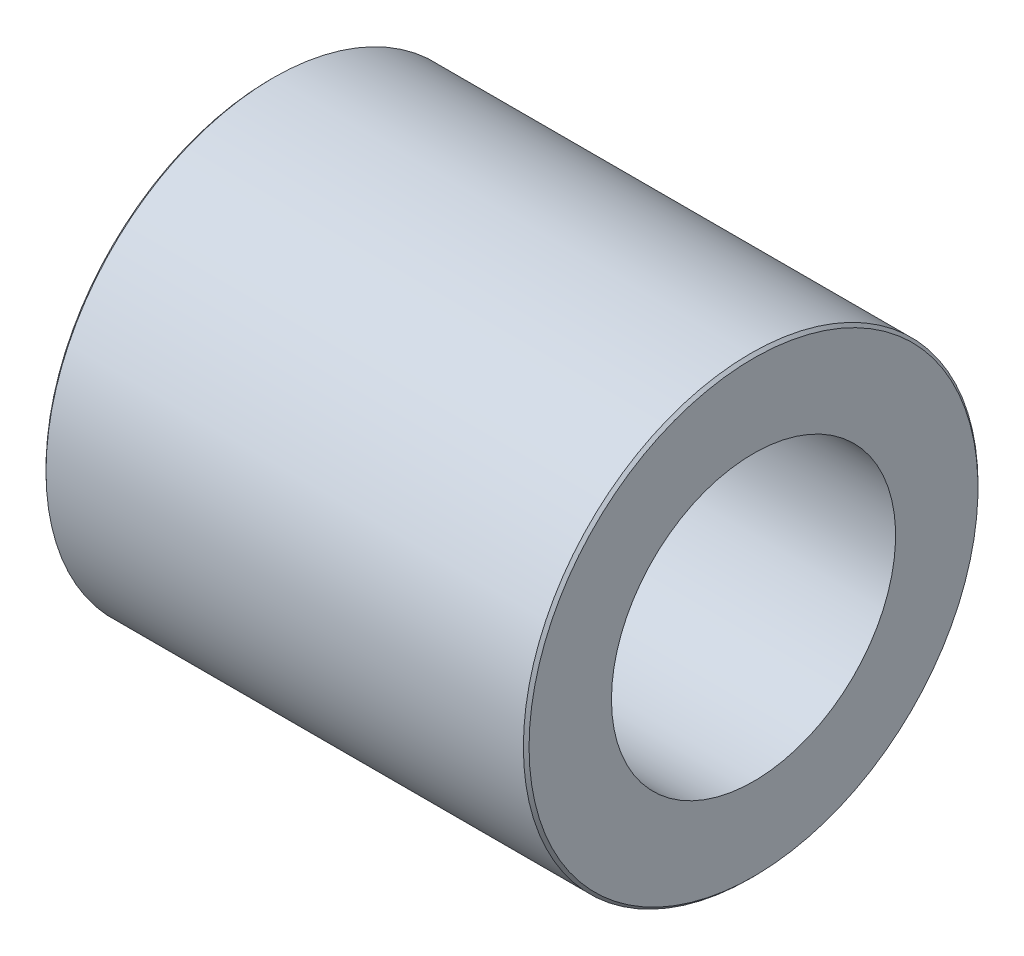
ISO-10303-21;
HEADER;
FILE_DESCRIPTION(('STEP AP214'),'2;1');
FILE_NAME('part.step','',(''),(''),'','','');
FILE_SCHEMA(('AUTOMOTIVE_DESIGN { 1 0 10303 214 1 1 1 1 }'));
ENDSEC;
DATA;
#1=APPLICATION_CONTEXT('core data for automotive mechanical design processes');
#2=APPLICATION_PROTOCOL_DEFINITION('international standard','automotive_design',2000,#1);
#3=PRODUCT_CONTEXT('',#1,'mechanical');
#4=PRODUCT('Part','Part','',(#3));
#5=PRODUCT_RELATED_PRODUCT_CATEGORY('part','',(#4));
#6=PRODUCT_DEFINITION_FORMATION('','',#4);
#7=PRODUCT_DEFINITION_CONTEXT('part definition',#1,'design');
#8=PRODUCT_DEFINITION('design','',#6,#7);
#9=PRODUCT_DEFINITION_SHAPE('','',#8);
#10=(LENGTH_UNIT() NAMED_UNIT(*) SI_UNIT(.MILLI.,.METRE.));
#11=(NAMED_UNIT(*) PLANE_ANGLE_UNIT() SI_UNIT($,.RADIAN.));
#12=(NAMED_UNIT(*) SI_UNIT($,.STERADIAN.) SOLID_ANGLE_UNIT());
#13=UNCERTAINTY_MEASURE_WITH_UNIT(LENGTH_MEASURE(1.E-05),#10,'distance_accuracy_value','');
#14=(GEOMETRIC_REPRESENTATION_CONTEXT(3) GLOBAL_UNCERTAINTY_ASSIGNED_CONTEXT((#13)) GLOBAL_UNIT_ASSIGNED_CONTEXT((#10,
#11,#12)) REPRESENTATION_CONTEXT('',''));
#15=CARTESIAN_POINT('',(0.,0.,0.));
#16=DIRECTION('',(0.,0.,1.));
#17=DIRECTION('',(1.,0.,0.));
#18=AXIS2_PLACEMENT_3D('',#15,#16,#17);
#19=CARTESIAN_POINT('',(2.8,-6.06217782649416,-3.49999999999663));
#20=DIRECTION('',(1.,0.,0.));
#21=DIRECTION('',(0.,0.,-1.));
#22=AXIS2_PLACEMENT_3D('',#19,#20,#21);
#23=PLANE('',#22);
#24=CARTESIAN_POINT('',(2.79999999997926,-5.6291651246,-3.25));
#25=DIRECTION('',(1.,0.,0.));
#26=DIRECTION('',(0.,0.,-1.));
#27=AXIS2_PLACEMENT_3D('',#24,#25,#26);
#28=CIRCLE('',#27,0.999999999950099);
#29=CARTESIAN_POINT('',(2.79999999997926,-5.6291651246,-4.2499999999501));
#30=VERTEX_POINT('',#29);
#31=EDGE_CURVE('E20',#30,#30,#28,.F.);
#32=ORIENTED_EDGE('',*,*,#31,.T.);
#33=EDGE_LOOP('',(#32));
#34=FACE_BOUND('',#33,.T.);
#35=ADVANCED_FACE('F17',(#34),#23,.F.);
#36=CARTESIAN_POINT('',(2.8,0.,7.));
#37=DIRECTION('',(1.,0.,0.));
#38=DIRECTION('',(0.,0.,-1.));
#39=AXIS2_PLACEMENT_3D('',#36,#37,#38);
#40=PLANE('',#39);
#41=CARTESIAN_POINT('',(2.79999999997926,0.,6.5));
#42=DIRECTION('',(1.,0.,0.));
#43=DIRECTION('',(0.,0.,-1.));
#44=AXIS2_PLACEMENT_3D('',#41,#42,#43);
#45=CIRCLE('',#44,1.00000000005002);
#46=CARTESIAN_POINT('',(2.79999999997926,0.,5.49999999994998));
#47=VERTEX_POINT('',#46);
#48=EDGE_CURVE('E180',#47,#47,#45,.F.);
#49=ORIENTED_EDGE('',*,*,#48,.T.);
#50=EDGE_LOOP('',(#49));
#51=FACE_BOUND('',#50,.T.);
#52=ADVANCED_FACE('F202',(#51),#40,.F.);
#53=CARTESIAN_POINT('',(2.8,6.06217782649416,-3.49999999999663));
#54=DIRECTION('',(1.,0.,0.));
#55=DIRECTION('',(0.,0.,-1.));
#56=AXIS2_PLACEMENT_3D('',#53,#54,#55);
#57=PLANE('',#56);
#58=CARTESIAN_POINT('',(2.79999999997926,5.6291651246,-3.25));
#59=DIRECTION('',(1.,0.,0.));
#60=DIRECTION('',(0.,0.,-1.));
#61=AXIS2_PLACEMENT_3D('',#58,#59,#60);
#62=CIRCLE('',#61,0.999999999950099);
#63=CARTESIAN_POINT('',(2.79999999997926,5.6291651246,-4.2499999999501));
#64=VERTEX_POINT('',#63);
#65=EDGE_CURVE('E153',#64,#64,#62,.F.);
#66=ORIENTED_EDGE('',*,*,#65,.T.);
#67=EDGE_LOOP('',(#66));
#68=FACE_BOUND('',#67,.T.);
#69=ADVANCED_FACE('F191',(#68),#57,.F.);
#70=CARTESIAN_POINT('',(2.79999999997926,-5.6291651246,-3.25));
#71=DIRECTION('',(1.,0.,0.));
#72=DIRECTION('',(0.,0.,-1.));
#73=AXIS2_PLACEMENT_3D('',#70,#71,#72);
#74=CONICAL_SURFACE('',#73,0.999999999950099,1.04718484908716);
#75=CARTESIAN_POINT('',(2.59999999997262,-5.6291651246,-3.25));
#76=DIRECTION('',(-1.,0.,0.));
#77=DIRECTION('',(0.,-0.866025403762104,-0.500000000038685));
#78=AXIS2_PLACEMENT_3D('',#75,#76,#77);
#79=CIRCLE('',#78,0.653599999987272);
#80=CARTESIAN_POINT('',(2.59999999997262,-6.19519932848789,-3.57680000001892));
#81=VERTEX_POINT('',#80);
#82=EDGE_CURVE('E150',#81,#81,#79,.T.);
#83=ORIENTED_EDGE('',*,*,#82,.T.);
#84=EDGE_LOOP('',(#83));
#85=FACE_BOUND('',#84,.T.);
#86=ORIENTED_EDGE('',*,*,#31,.F.);
#87=EDGE_LOOP('',(#86));
#88=FACE_BOUND('',#87,.T.);
#89=ADVANCED_FACE('F188',(#85,#88),#74,.F.);
#90=CARTESIAN_POINT('',(2.79999999997926,0.,6.5));
#91=DIRECTION('',(1.,0.,0.));
#92=DIRECTION('',(0.,0.,-1.));
#93=AXIS2_PLACEMENT_3D('',#90,#91,#92);
#94=CONICAL_SURFACE('',#93,1.00000000005002,1.04718484909684);
#95=CARTESIAN_POINT('',(2.60000000002947,0.,6.5));
#96=DIRECTION('',(-1.,0.,0.));
#97=DIRECTION('',(0.,0.,1.));
#98=AXIS2_PLACEMENT_3D('',#95,#96,#97);
#99=CIRCLE('',#98,0.653599999980997);
#100=CARTESIAN_POINT('',(2.60000000002947,0.,7.153599999981));
#101=VERTEX_POINT('',#100);
#102=EDGE_CURVE('E147',#101,#101,#99,.T.);
#103=ORIENTED_EDGE('',*,*,#102,.T.);
#104=EDGE_LOOP('',(#103));
#105=FACE_BOUND('',#104,.T.);
#106=ORIENTED_EDGE('',*,*,#48,.F.);
#107=EDGE_LOOP('',(#106));
#108=FACE_BOUND('',#107,.T.);
#109=ADVANCED_FACE('F190',(#105,#108),#94,.F.);
#110=CARTESIAN_POINT('',(2.79999999997926,5.6291651246,-3.25));
#111=DIRECTION('',(1.,0.,0.));
#112=DIRECTION('',(0.,0.,-1.));
#113=AXIS2_PLACEMENT_3D('',#110,#111,#112);
#114=CONICAL_SURFACE('',#113,0.999999999950099,1.04718484908716);
#115=CARTESIAN_POINT('',(2.59999999997262,5.6291651246,-3.25));
#116=DIRECTION('',(-1.,0.,0.));
#117=DIRECTION('',(0.,0.866025403762104,-0.500000000038685));
#118=AXIS2_PLACEMENT_3D('',#115,#116,#117);
#119=CIRCLE('',#118,0.653599999987272);
#120=CARTESIAN_POINT('',(2.59999999997262,6.19519932848789,-3.57680000001892));
#121=VERTEX_POINT('',#120);
#122=EDGE_CURVE('E144',#121,#121,#119,.T.);
#123=ORIENTED_EDGE('',*,*,#122,.T.);
#124=EDGE_LOOP('',(#123));
#125=FACE_BOUND('',#124,.T.);
#126=ORIENTED_EDGE('',*,*,#65,.F.);
#127=EDGE_LOOP('',(#126));
#128=FACE_BOUND('',#127,.T.);
#129=ADVANCED_FACE('F199',(#125,#128),#114,.F.);
#130=CARTESIAN_POINT('',(2.40000000002283,-5.6291651246,-3.25));
#131=DIRECTION('',(-1.,0.,0.));
#132=DIRECTION('',(0.,0.,1.));
#133=AXIS2_PLACEMENT_3D('',#130,#131,#132);
#134=CONICAL_SURFACE('',#133,0.999999999950099,1.04718484908716);
#135=CARTESIAN_POINT('',(2.40000000002283,-5.6291651246,-3.25));
#136=DIRECTION('',(1.,0.,0.));
#137=DIRECTION('',(0.,-0.866025403755594,-0.500000000049961));
#138=AXIS2_PLACEMENT_3D('',#135,#136,#137);
#139=CIRCLE('',#138,0.999999999950099);
#140=CARTESIAN_POINT('',(2.40000000002283,-6.49519052831238,-3.75000000002501));
#141=VERTEX_POINT('',#140);
#142=EDGE_CURVE('E141',#141,#141,#139,.F.);
#143=ORIENTED_EDGE('',*,*,#142,.T.);
#144=EDGE_LOOP('',(#143));
#145=FACE_BOUND('',#144,.T.);
#146=ORIENTED_EDGE('',*,*,#82,.F.);
#147=EDGE_LOOP('',(#146));
#148=FACE_BOUND('',#147,.T.);
#149=ADVANCED_FACE('F387',(#145,#148),#134,.F.);
#150=CARTESIAN_POINT('',(2.40000000002283,0.,6.5));
#151=DIRECTION('',(-1.,0.,0.));
#152=DIRECTION('',(0.,0.,1.));
#153=AXIS2_PLACEMENT_3D('',#150,#151,#152);
#154=CONICAL_SURFACE('',#153,1.00000000005002,1.04718484909684);
#155=CARTESIAN_POINT('',(2.40000000002283,0.,6.5));
#156=DIRECTION('',(1.,0.,0.));
#157=DIRECTION('',(0.,0.,1.));
#158=AXIS2_PLACEMENT_3D('',#155,#156,#157);
#159=CIRCLE('',#158,0.999999999993178);
#160=CARTESIAN_POINT('',(2.40000000002283,0.,7.49999999999318));
#161=VERTEX_POINT('',#160);
#162=EDGE_CURVE('E138',#161,#161,#159,.F.);
#163=ORIENTED_EDGE('',*,*,#162,.T.);
#164=EDGE_LOOP('',(#163));
#165=FACE_BOUND('',#164,.T.);
#166=ORIENTED_EDGE('',*,*,#102,.F.);
#167=EDGE_LOOP('',(#166));
#168=FACE_BOUND('',#167,.T.);
#169=ADVANCED_FACE('F383',(#165,#168),#154,.F.);
#170=CARTESIAN_POINT('',(2.40000000002283,5.6291651246,-3.25));
#171=DIRECTION('',(-1.,0.,0.));
#172=DIRECTION('',(0.,0.,1.));
#173=AXIS2_PLACEMENT_3D('',#170,#171,#172);
#174=CONICAL_SURFACE('',#173,0.999999999950099,1.04718484908716);
#175=CARTESIAN_POINT('',(2.40000000002283,5.6291651246,-3.25));
#176=DIRECTION('',(1.,0.,0.));
#177=DIRECTION('',(0.,0.866025403755594,-0.500000000049961));
#178=AXIS2_PLACEMENT_3D('',#175,#176,#177);
#179=CIRCLE('',#178,0.999999999950099);
#180=CARTESIAN_POINT('',(2.40000000002283,6.49519052831238,-3.75000000002501));
#181=VERTEX_POINT('',#180);
#182=EDGE_CURVE('E135',#181,#181,#179,.F.);
#183=ORIENTED_EDGE('',*,*,#182,.T.);
#184=EDGE_LOOP('',(#183));
#185=FACE_BOUND('',#184,.T.);
#186=ORIENTED_EDGE('',*,*,#122,.F.);
#187=EDGE_LOOP('',(#186));
#188=FACE_BOUND('',#187,.T.);
#189=ADVANCED_FACE('F379',(#185,#188),#174,.F.);
#190=CARTESIAN_POINT('',(2.39999999996598,-5.6291651246,-3.25));
#191=DIRECTION('',(1.,0.,0.));
#192=DIRECTION('',(0.,0.,-1.));
#193=AXIS2_PLACEMENT_3D('',#190,#191,#192);
#194=CONICAL_SURFACE('',#193,0.99999999987245,1.04718484892856);
#195=CARTESIAN_POINT('',(2.19999999995935,-5.6291651246,-3.25));
#196=DIRECTION('',(-1.,0.,0.));
#197=DIRECTION('',(0.,-0.866025403762104,-0.500000000038685));
#198=AXIS2_PLACEMENT_3D('',#195,#196,#197);
#199=CIRCLE('',#198,0.653599999987272);
#200=CARTESIAN_POINT('',(2.19999999995935,-6.19519932848789,-3.57680000001892));
#201=VERTEX_POINT('',#200);
#202=EDGE_CURVE('E132',#201,#201,#199,.T.);
#203=ORIENTED_EDGE('',*,*,#202,.T.);
#204=EDGE_LOOP('',(#203));
#205=FACE_BOUND('',#204,.T.);
#206=ORIENTED_EDGE('',*,*,#142,.F.);
#207=EDGE_LOOP('',(#206));
#208=FACE_BOUND('',#207,.T.);
#209=ADVANCED_FACE('F375',(#205,#208),#194,.F.);
#210=CARTESIAN_POINT('',(2.39999999990914,0.,6.5));
#211=DIRECTION('',(1.,0.,0.));
#212=DIRECTION('',(0.,0.,-1.));
#213=AXIS2_PLACEMENT_3D('',#210,#211,#212);
#214=CONICAL_SURFACE('',#213,0.999999999765805,1.04718484907779);
#215=CARTESIAN_POINT('',(2.20000000001619,0.,6.5));
#216=DIRECTION('',(-1.,0.,0.));
#217=DIRECTION('',(0.,0.,1.));
#218=AXIS2_PLACEMENT_3D('',#215,#216,#217);
#219=CIRCLE('',#218,0.653599999980997);
#220=CARTESIAN_POINT('',(2.20000000001619,0.,7.153599999981));
#221=VERTEX_POINT('',#220);
#222=EDGE_CURVE('E129',#221,#221,#219,.T.);
#223=ORIENTED_EDGE('',*,*,#222,.T.);
#224=EDGE_LOOP('',(#223));
#225=FACE_BOUND('',#224,.T.);
#226=ORIENTED_EDGE('',*,*,#162,.F.);
#227=EDGE_LOOP('',(#226));
#228=FACE_BOUND('',#227,.T.);
#229=ADVANCED_FACE('F371',(#225,#228),#214,.F.);
#230=CARTESIAN_POINT('',(2.39999999996598,5.6291651246,-3.25));
#231=DIRECTION('',(1.,0.,0.));
#232=DIRECTION('',(0.,0.,-1.));
#233=AXIS2_PLACEMENT_3D('',#230,#231,#232);
#234=CONICAL_SURFACE('',#233,0.99999999987245,1.04718484892856);
#235=CARTESIAN_POINT('',(2.19999999995935,5.6291651246,-3.25));
#236=DIRECTION('',(-1.,0.,0.));
#237=DIRECTION('',(0.,0.866025403762104,-0.500000000038685));
#238=AXIS2_PLACEMENT_3D('',#235,#236,#237);
#239=CIRCLE('',#238,0.653599999987272);
#240=CARTESIAN_POINT('',(2.19999999995935,6.19519932848789,-3.57680000001892));
#241=VERTEX_POINT('',#240);
#242=EDGE_CURVE('E126',#241,#241,#239,.T.);
#243=ORIENTED_EDGE('',*,*,#242,.T.);
#244=EDGE_LOOP('',(#243));
#245=FACE_BOUND('',#244,.T.);
#246=ORIENTED_EDGE('',*,*,#182,.F.);
#247=EDGE_LOOP('',(#246));
#248=FACE_BOUND('',#247,.T.);
#249=ADVANCED_FACE('F367',(#245,#248),#234,.F.);
#250=CARTESIAN_POINT('',(2.00000000000955,-5.6291651246,-3.25));
#251=DIRECTION('',(-1.,0.,0.));
#252=DIRECTION('',(0.,0.,1.));
#253=AXIS2_PLACEMENT_3D('',#250,#251,#252);
#254=CONICAL_SURFACE('',#253,0.999999999950099,1.04718484908716);
#255=CARTESIAN_POINT('',(2.00000000000955,-5.6291651246,-3.25));
#256=DIRECTION('',(1.,0.,0.));
#257=DIRECTION('',(0.,-0.866025403755594,-0.500000000049961));
#258=AXIS2_PLACEMENT_3D('',#255,#256,#257);
#259=CIRCLE('',#258,0.999999999950099);
#260=CARTESIAN_POINT('',(2.00000000000955,-6.49519052831238,-3.75000000002501));
#261=VERTEX_POINT('',#260);
#262=EDGE_CURVE('E123',#261,#261,#259,.F.);
#263=ORIENTED_EDGE('',*,*,#262,.T.);
#264=EDGE_LOOP('',(#263));
#265=FACE_BOUND('',#264,.T.);
#266=ORIENTED_EDGE('',*,*,#202,.F.);
#267=EDGE_LOOP('',(#266));
#268=FACE_BOUND('',#267,.T.);
#269=ADVANCED_FACE('F363',(#265,#268),#254,.F.);
#270=CARTESIAN_POINT('',(2.00000000000955,0.,6.5));
#271=DIRECTION('',(-1.,0.,0.));
#272=DIRECTION('',(0.,0.,1.));
#273=AXIS2_PLACEMENT_3D('',#270,#271,#272);
#274=CONICAL_SURFACE('',#273,1.00000000005002,1.04718484909684);
#275=CARTESIAN_POINT('',(2.00000000000955,0.,6.5));
#276=DIRECTION('',(1.,0.,0.));
#277=DIRECTION('',(0.,0.,1.));
#278=AXIS2_PLACEMENT_3D('',#275,#276,#277);
#279=CIRCLE('',#278,0.999999999993178);
#280=CARTESIAN_POINT('',(2.00000000000955,0.,7.49999999999318));
#281=VERTEX_POINT('',#280);
#282=EDGE_CURVE('E120',#281,#281,#279,.F.);
#283=ORIENTED_EDGE('',*,*,#282,.T.);
#284=EDGE_LOOP('',(#283));
#285=FACE_BOUND('',#284,.T.);
#286=ORIENTED_EDGE('',*,*,#222,.F.);
#287=EDGE_LOOP('',(#286));
#288=FACE_BOUND('',#287,.T.);
#289=ADVANCED_FACE('F359',(#285,#288),#274,.F.);
#290=CARTESIAN_POINT('',(2.00000000000955,5.6291651246,-3.25));
#291=DIRECTION('',(-1.,0.,0.));
#292=DIRECTION('',(0.,0.,1.));
#293=AXIS2_PLACEMENT_3D('',#290,#291,#292);
#294=CONICAL_SURFACE('',#293,0.999999999950099,1.04718484908716);
#295=CARTESIAN_POINT('',(2.00000000000955,5.6291651246,-3.25));
#296=DIRECTION('',(1.,0.,0.));
#297=DIRECTION('',(0.,0.866025403755594,-0.500000000049961));
#298=AXIS2_PLACEMENT_3D('',#295,#296,#297);
#299=CIRCLE('',#298,0.999999999950099);
#300=CARTESIAN_POINT('',(2.00000000000955,6.49519052831238,-3.75000000002501));
#301=VERTEX_POINT('',#300);
#302=EDGE_CURVE('E117',#301,#301,#299,.F.);
#303=ORIENTED_EDGE('',*,*,#302,.T.);
#304=EDGE_LOOP('',(#303));
#305=FACE_BOUND('',#304,.T.);
#306=ORIENTED_EDGE('',*,*,#242,.F.);
#307=EDGE_LOOP('',(#306));
#308=FACE_BOUND('',#307,.T.);
#309=ADVANCED_FACE('F355',(#305,#308),#294,.F.);
#310=CARTESIAN_POINT('',(1.99999999995271,-5.6291651246,-3.25));
#311=DIRECTION('',(1.,0.,0.));
#312=DIRECTION('',(0.,0.,-1.));
#313=AXIS2_PLACEMENT_3D('',#310,#311,#312);
#314=CONICAL_SURFACE('',#313,0.99999999987245,1.04718484892856);
#315=CARTESIAN_POINT('',(1.80000000000291,-5.6291651246,-3.25));
#316=DIRECTION('',(-1.,0.,0.));
#317=DIRECTION('',(0.,-0.866025403724445,-0.500000000103912));
#318=AXIS2_PLACEMENT_3D('',#315,#316,#317);
#319=CIRCLE('',#318,0.653600000015693);
#320=CARTESIAN_POINT('',(1.80000000000291,-6.19519932848789,-3.57680000007576));
#321=VERTEX_POINT('',#320);
#322=EDGE_CURVE('E114',#321,#321,#319,.T.);
#323=ORIENTED_EDGE('',*,*,#322,.T.);
#324=EDGE_LOOP('',(#323));
#325=FACE_BOUND('',#324,.T.);
#326=ORIENTED_EDGE('',*,*,#262,.F.);
#327=EDGE_LOOP('',(#326));
#328=FACE_BOUND('',#327,.T.);
#329=ADVANCED_FACE('F351',(#325,#328),#314,.F.);
#330=CARTESIAN_POINT('',(1.99999999989586,0.,6.5));
#331=DIRECTION('',(1.,0.,0.));
#332=DIRECTION('',(0.,0.,-1.));
#333=AXIS2_PLACEMENT_3D('',#330,#331,#332);
#334=CONICAL_SURFACE('',#333,0.999999999765805,1.04718484907779);
#335=CARTESIAN_POINT('',(1.79999999994607,0.,6.5));
#336=DIRECTION('',(-1.,0.,0.));
#337=DIRECTION('',(0.,0.,1.));
#338=AXIS2_PLACEMENT_3D('',#335,#336,#337);
#339=CIRCLE('',#338,0.65360000003784);
#340=CARTESIAN_POINT('',(1.79999999994607,0.,7.15360000003784));
#341=VERTEX_POINT('',#340);
#342=EDGE_CURVE('E111',#341,#341,#339,.T.);
#343=ORIENTED_EDGE('',*,*,#342,.T.);
#344=EDGE_LOOP('',(#343));
#345=FACE_BOUND('',#344,.T.);
#346=ORIENTED_EDGE('',*,*,#282,.F.);
#347=EDGE_LOOP('',(#346));
#348=FACE_BOUND('',#347,.T.);
#349=ADVANCED_FACE('F347',(#345,#348),#334,.F.);
#350=CARTESIAN_POINT('',(1.99999999995271,5.6291651246,-3.25));
#351=DIRECTION('',(1.,0.,0.));
#352=DIRECTION('',(0.,0.,-1.));
#353=AXIS2_PLACEMENT_3D('',#350,#351,#352);
#354=CONICAL_SURFACE('',#353,0.99999999987245,1.04718484892856);
#355=CARTESIAN_POINT('',(1.80000000000291,5.6291651246,-3.25));
#356=DIRECTION('',(-1.,0.,0.));
#357=DIRECTION('',(0.,0.866025403724445,-0.500000000103912));
#358=AXIS2_PLACEMENT_3D('',#355,#356,#357);
#359=CIRCLE('',#358,0.653600000015693);
#360=CARTESIAN_POINT('',(1.80000000000291,6.19519932848789,-3.57680000007576));
#361=VERTEX_POINT('',#360);
#362=EDGE_CURVE('E108',#361,#361,#359,.T.);
#363=ORIENTED_EDGE('',*,*,#362,.T.);
#364=EDGE_LOOP('',(#363));
#365=FACE_BOUND('',#364,.T.);
#366=ORIENTED_EDGE('',*,*,#302,.F.);
#367=EDGE_LOOP('',(#366));
#368=FACE_BOUND('',#367,.T.);
#369=ADVANCED_FACE('F343',(#365,#368),#354,.F.);
#370=CARTESIAN_POINT('',(1.60000000005311,-5.6291651246,-3.25));
#371=DIRECTION('',(-1.,0.,0.));
#372=DIRECTION('',(0.,0.,1.));
#373=AXIS2_PLACEMENT_3D('',#370,#371,#372);
#374=CONICAL_SURFACE('',#373,0.99999999987245,1.04718484892856);
#375=CARTESIAN_POINT('',(1.60000000005311,-5.6291651246,-3.25));
#376=DIRECTION('',(1.,0.,0.));
#377=DIRECTION('',(0.,-0.866025403755594,-0.500000000049961));
#378=AXIS2_PLACEMENT_3D('',#375,#376,#377);
#379=CIRCLE('',#378,0.999999999950099);
#380=CARTESIAN_POINT('',(1.60000000005311,-6.49519052831238,-3.75000000002501));
#381=VERTEX_POINT('',#380);
#382=EDGE_CURVE('E105',#381,#381,#379,.F.);
#383=ORIENTED_EDGE('',*,*,#382,.T.);
#384=EDGE_LOOP('',(#383));
#385=FACE_BOUND('',#384,.T.);
#386=ORIENTED_EDGE('',*,*,#322,.F.);
#387=EDGE_LOOP('',(#386));
#388=FACE_BOUND('',#387,.T.);
#389=ADVANCED_FACE('F339',(#385,#388),#374,.F.);
#390=CARTESIAN_POINT('',(1.60000000010996,0.,6.5));
#391=DIRECTION('',(-1.,0.,0.));
#392=DIRECTION('',(0.,-1.,0.));
#393=AXIS2_PLACEMENT_3D('',#390,#391,#392);
#394=CONICAL_SURFACE('',#393,0.999999999765805,1.04718484907779);
#395=CARTESIAN_POINT('',(1.60000000005311,0.,6.5));
#396=DIRECTION('',(1.,0.,0.));
#397=DIRECTION('',(0.,0.,1.));
#398=AXIS2_PLACEMENT_3D('',#395,#396,#397);
#399=CIRCLE('',#398,0.999999999993178);
#400=CARTESIAN_POINT('',(1.60000000005311,0.,7.49999999999318));
#401=VERTEX_POINT('',#400);
#402=EDGE_CURVE('E102',#401,#401,#399,.F.);
#403=ORIENTED_EDGE('',*,*,#402,.T.);
#404=EDGE_LOOP('',(#403));
#405=FACE_BOUND('',#404,.T.);
#406=ORIENTED_EDGE('',*,*,#342,.F.);
#407=EDGE_LOOP('',(#406));
#408=FACE_BOUND('',#407,.T.);
#409=ADVANCED_FACE('F335',(#405,#408),#394,.F.);
#410=CARTESIAN_POINT('',(1.60000000005311,5.6291651246,-3.25));
#411=DIRECTION('',(-1.,0.,0.));
#412=DIRECTION('',(0.,0.,1.));
#413=AXIS2_PLACEMENT_3D('',#410,#411,#412);
#414=CONICAL_SURFACE('',#413,0.99999999987245,1.04718484892856);
#415=CARTESIAN_POINT('',(1.60000000005311,5.6291651246,-3.25));
#416=DIRECTION('',(1.,0.,0.));
#417=DIRECTION('',(0.,0.866025403755594,-0.500000000049961));
#418=AXIS2_PLACEMENT_3D('',#415,#416,#417);
#419=CIRCLE('',#418,0.999999999950099);
#420=CARTESIAN_POINT('',(1.60000000005311,6.49519052831238,-3.75000000002501));
#421=VERTEX_POINT('',#420);
#422=EDGE_CURVE('E99',#421,#421,#419,.F.);
#423=ORIENTED_EDGE('',*,*,#422,.T.);
#424=EDGE_LOOP('',(#423));
#425=FACE_BOUND('',#424,.T.);
#426=ORIENTED_EDGE('',*,*,#362,.F.);
#427=EDGE_LOOP('',(#426));
#428=FACE_BOUND('',#427,.T.);
#429=ADVANCED_FACE('F331',(#425,#428),#414,.F.);
#430=CARTESIAN_POINT('',(1.59999999999627,-5.6291651246,-3.25));
#431=DIRECTION('',(1.,0.,0.));
#432=DIRECTION('',(0.,0.,-1.));
#433=AXIS2_PLACEMENT_3D('',#430,#431,#432);
#434=CONICAL_SURFACE('',#433,0.99999999987245,1.04718484892856);
#435=CARTESIAN_POINT('',(1.39999999998963,-5.6291651246,-3.25));
#436=DIRECTION('',(-1.,0.,0.));
#437=DIRECTION('',(0.,-0.866025403724445,-0.500000000103912));
#438=AXIS2_PLACEMENT_3D('',#435,#436,#437);
#439=CIRCLE('',#438,0.653600000015693);
#440=CARTESIAN_POINT('',(1.39999999998963,-6.19519932848789,-3.57680000007576));
#441=VERTEX_POINT('',#440);
#442=EDGE_CURVE('E96',#441,#441,#439,.T.);
#443=ORIENTED_EDGE('',*,*,#442,.T.);
#444=EDGE_LOOP('',(#443));
#445=FACE_BOUND('',#444,.T.);
#446=ORIENTED_EDGE('',*,*,#382,.F.);
#447=EDGE_LOOP('',(#446));
#448=FACE_BOUND('',#447,.T.);
#449=ADVANCED_FACE('F327',(#445,#448),#434,.F.);
#450=CARTESIAN_POINT('',(1.59999999993943,0.,6.5));
#451=DIRECTION('',(1.,0.,0.));
#452=DIRECTION('',(0.,1.,0.));
#453=AXIS2_PLACEMENT_3D('',#450,#451,#452);
#454=CONICAL_SURFACE('',#453,0.999999999765805,1.04718484902578);
#455=CARTESIAN_POINT('',(1.39999999993279,0.,6.5));
#456=DIRECTION('',(-1.,0.,0.));
#457=DIRECTION('',(0.,0.,1.));
#458=AXIS2_PLACEMENT_3D('',#455,#456,#457);
#459=CIRCLE('',#458,0.65360000003784);
#460=CARTESIAN_POINT('',(1.39999999993279,0.,7.15360000003784));
#461=VERTEX_POINT('',#460);
#462=EDGE_CURVE('E93',#461,#461,#459,.T.);
#463=ORIENTED_EDGE('',*,*,#462,.T.);
#464=EDGE_LOOP('',(#463));
#465=FACE_BOUND('',#464,.T.);
#466=ORIENTED_EDGE('',*,*,#402,.F.);
#467=EDGE_LOOP('',(#466));
#468=FACE_BOUND('',#467,.T.);
#469=ADVANCED_FACE('F323',(#465,#468),#454,.F.);
#470=CARTESIAN_POINT('',(1.59999999999627,5.6291651246,-3.25));
#471=DIRECTION('',(1.,0.,0.));
#472=DIRECTION('',(0.,0.,-1.));
#473=AXIS2_PLACEMENT_3D('',#470,#471,#472);
#474=CONICAL_SURFACE('',#473,0.99999999987245,1.04718484892856);
#475=CARTESIAN_POINT('',(1.39999999998963,5.6291651246,-3.25));
#476=DIRECTION('',(-1.,0.,0.));
#477=DIRECTION('',(0.,0.866025403724445,-0.500000000103912));
#478=AXIS2_PLACEMENT_3D('',#475,#476,#477);
#479=CIRCLE('',#478,0.653600000015693);
#480=CARTESIAN_POINT('',(1.39999999998963,6.19519932848789,-3.57680000007576));
#481=VERTEX_POINT('',#480);
#482=EDGE_CURVE('E90',#481,#481,#479,.T.);
#483=ORIENTED_EDGE('',*,*,#482,.T.);
#484=EDGE_LOOP('',(#483));
#485=FACE_BOUND('',#484,.T.);
#486=ORIENTED_EDGE('',*,*,#422,.F.);
#487=EDGE_LOOP('',(#486));
#488=FACE_BOUND('',#487,.T.);
#489=ADVANCED_FACE('F319',(#485,#488),#474,.F.);
#490=CARTESIAN_POINT('',(1.20000000003984,-5.6291651246,-3.25));
#491=DIRECTION('',(-1.,0.,0.));
#492=DIRECTION('',(0.,0.,1.));
#493=AXIS2_PLACEMENT_3D('',#490,#491,#492);
#494=CONICAL_SURFACE('',#493,0.99999999987245,1.04718484892856);
#495=CARTESIAN_POINT('',(1.20000000003984,-5.6291651246,-3.25));
#496=DIRECTION('',(1.,0.,0.));
#497=DIRECTION('',(0.,-0.866025403755594,-0.500000000049961));
#498=AXIS2_PLACEMENT_3D('',#495,#496,#497);
#499=CIRCLE('',#498,0.999999999950099);
#500=CARTESIAN_POINT('',(1.20000000003984,-6.49519052831238,-3.75000000002501));
#501=VERTEX_POINT('',#500);
#502=EDGE_CURVE('E87',#501,#501,#499,.F.);
#503=ORIENTED_EDGE('',*,*,#502,.T.);
#504=EDGE_LOOP('',(#503));
#505=FACE_BOUND('',#504,.T.);
#506=ORIENTED_EDGE('',*,*,#442,.F.);
#507=EDGE_LOOP('',(#506));
#508=FACE_BOUND('',#507,.T.);
#509=ADVANCED_FACE('F315',(#505,#508),#494,.F.);
#510=CARTESIAN_POINT('',(1.20000000009668,0.,6.5));
#511=DIRECTION('',(-1.,0.,0.));
#512=DIRECTION('',(0.,0.,1.));
#513=AXIS2_PLACEMENT_3D('',#510,#511,#512);
#514=CONICAL_SURFACE('',#513,0.999999999765805,1.04718484907779);
#515=CARTESIAN_POINT('',(1.20000000003984,0.,6.5));
#516=DIRECTION('',(1.,0.,0.));
#517=DIRECTION('',(0.,0.,1.));
#518=AXIS2_PLACEMENT_3D('',#515,#516,#517);
#519=CIRCLE('',#518,0.999999999993178);
#520=CARTESIAN_POINT('',(1.20000000003984,0.,7.49999999999318));
#521=VERTEX_POINT('',#520);
#522=EDGE_CURVE('E84',#521,#521,#519,.F.);
#523=ORIENTED_EDGE('',*,*,#522,.T.);
#524=EDGE_LOOP('',(#523));
#525=FACE_BOUND('',#524,.T.);
#526=ORIENTED_EDGE('',*,*,#462,.F.);
#527=EDGE_LOOP('',(#526));
#528=FACE_BOUND('',#527,.T.);
#529=ADVANCED_FACE('F311',(#525,#528),#514,.F.);
#530=CARTESIAN_POINT('',(1.20000000003984,5.6291651246,-3.25));
#531=DIRECTION('',(-1.,0.,0.));
#532=DIRECTION('',(0.,0.,1.));
#533=AXIS2_PLACEMENT_3D('',#530,#531,#532);
#534=CONICAL_SURFACE('',#533,0.99999999987245,1.04718484892856);
#535=CARTESIAN_POINT('',(1.20000000003984,5.6291651246,-3.25));
#536=DIRECTION('',(1.,0.,0.));
#537=DIRECTION('',(0.,0.866025403755594,-0.500000000049961));
#538=AXIS2_PLACEMENT_3D('',#535,#536,#537);
#539=CIRCLE('',#538,0.999999999950099);
#540=CARTESIAN_POINT('',(1.20000000003984,6.49519052831238,-3.75000000002501));
#541=VERTEX_POINT('',#540);
#542=EDGE_CURVE('E81',#541,#541,#539,.F.);
#543=ORIENTED_EDGE('',*,*,#542,.T.);
#544=EDGE_LOOP('',(#543));
#545=FACE_BOUND('',#544,.T.);
#546=ORIENTED_EDGE('',*,*,#482,.F.);
#547=EDGE_LOOP('',(#546));
#548=FACE_BOUND('',#547,.T.);
#549=ADVANCED_FACE('F307',(#545,#548),#534,.F.);
#550=CARTESIAN_POINT('',(1.19999999998299,-5.6291651246,-3.25));
#551=DIRECTION('',(1.,0.,0.));
#552=DIRECTION('',(0.,0.,-1.));
#553=AXIS2_PLACEMENT_3D('',#550,#551,#552);
#554=CONICAL_SURFACE('',#553,0.99999999987245,1.04718484892856);
#555=CARTESIAN_POINT('',(0.999999999976353,-5.6291651246,-3.25));
#556=DIRECTION('',(-1.,0.,0.));
#557=DIRECTION('',(0.,-0.866025403724445,-0.500000000103912));
#558=AXIS2_PLACEMENT_3D('',#555,#556,#557);
#559=CIRCLE('',#558,0.653600000015693);
#560=CARTESIAN_POINT('',(0.999999999976353,-6.19519932848789,-3.57680000007576));
#561=VERTEX_POINT('',#560);
#562=EDGE_CURVE('E78',#561,#561,#559,.T.);
#563=ORIENTED_EDGE('',*,*,#562,.T.);
#564=EDGE_LOOP('',(#563));
#565=FACE_BOUND('',#564,.T.);
#566=ORIENTED_EDGE('',*,*,#502,.F.);
#567=EDGE_LOOP('',(#566));
#568=FACE_BOUND('',#567,.T.);
#569=ADVANCED_FACE('F303',(#565,#568),#554,.F.);
#570=CARTESIAN_POINT('',(1.19999999992615,0.,6.5));
#571=DIRECTION('',(1.,0.,0.));
#572=DIRECTION('',(0.,0.,-1.));
#573=AXIS2_PLACEMENT_3D('',#570,#571,#572);
#574=CONICAL_SURFACE('',#573,0.999999999765805,1.04718484902578);
#575=CARTESIAN_POINT('',(0.999999999976353,0.,6.5));
#576=DIRECTION('',(-1.,0.,0.));
#577=DIRECTION('',(0.,0.,1.));
#578=AXIS2_PLACEMENT_3D('',#575,#576,#577);
#579=CIRCLE('',#578,0.653599999980997);
#580=CARTESIAN_POINT('',(0.999999999976353,0.,7.153599999981));
#581=VERTEX_POINT('',#580);
#582=EDGE_CURVE('E75',#581,#581,#579,.T.);
#583=ORIENTED_EDGE('',*,*,#582,.T.);
#584=EDGE_LOOP('',(#583));
#585=FACE_BOUND('',#584,.T.);
#586=ORIENTED_EDGE('',*,*,#522,.F.);
#587=EDGE_LOOP('',(#586));
#588=FACE_BOUND('',#587,.T.);
#589=ADVANCED_FACE('F299',(#585,#588),#574,.F.);
#590=CARTESIAN_POINT('',(1.19999999998299,5.6291651246,-3.25));
#591=DIRECTION('',(1.,0.,0.));
#592=DIRECTION('',(0.,0.,-1.));
#593=AXIS2_PLACEMENT_3D('',#590,#591,#592);
#594=CONICAL_SURFACE('',#593,0.99999999987245,1.04718484892856);
#595=CARTESIAN_POINT('',(0.999999999976353,5.6291651246,-3.25));
#596=DIRECTION('',(-1.,0.,0.));
#597=DIRECTION('',(0.,0.866025403724445,-0.500000000103912));
#598=AXIS2_PLACEMENT_3D('',#595,#596,#597);
#599=CIRCLE('',#598,0.653600000015693);
#600=CARTESIAN_POINT('',(0.999999999976353,6.19519932848789,-3.57680000007576));
#601=VERTEX_POINT('',#600);
#602=EDGE_CURVE('E72',#601,#601,#599,.T.);
#603=ORIENTED_EDGE('',*,*,#602,.T.);
#604=EDGE_LOOP('',(#603));
#605=FACE_BOUND('',#604,.T.);
#606=ORIENTED_EDGE('',*,*,#542,.F.);
#607=EDGE_LOOP('',(#606));
#608=FACE_BOUND('',#607,.T.);
#609=ADVANCED_FACE('F295',(#605,#608),#594,.F.);
#610=CARTESIAN_POINT('',(0.800000000026557,-5.6291651246,-3.25));
#611=DIRECTION('',(-1.,0.,0.));
#612=DIRECTION('',(0.,0.,1.));
#613=AXIS2_PLACEMENT_3D('',#610,#611,#612);
#614=CONICAL_SURFACE('',#613,0.999999999950099,1.04718484902562);
#615=CARTESIAN_POINT('',(0.800000000026557,-5.6291651246,-3.25));
#616=DIRECTION('',(1.,0.,0.));
#617=DIRECTION('',(0.,-0.866025403755594,-0.500000000049961));
#618=AXIS2_PLACEMENT_3D('',#615,#616,#617);
#619=CIRCLE('',#618,0.999999999950099);
#620=CARTESIAN_POINT('',(0.800000000026557,-6.49519052831238,-3.75000000002501));
#621=VERTEX_POINT('',#620);
#622=EDGE_CURVE('E69',#621,#621,#619,.F.);
#623=ORIENTED_EDGE('',*,*,#622,.T.);
#624=EDGE_LOOP('',(#623));
#625=FACE_BOUND('',#624,.T.);
#626=ORIENTED_EDGE('',*,*,#562,.F.);
#627=EDGE_LOOP('',(#626));
#628=FACE_BOUND('',#627,.T.);
#629=ADVANCED_FACE('F291',(#625,#628),#614,.F.);
#630=CARTESIAN_POINT('',(0.800000000083401,0.,6.5));
#631=DIRECTION('',(-1.,0.,0.));
#632=DIRECTION('',(0.,0.,1.));
#633=AXIS2_PLACEMENT_3D('',#630,#631,#632);
#634=CONICAL_SURFACE('',#633,0.999999999879491,1.04718484907779);
#635=CARTESIAN_POINT('',(0.799999999969714,0.,6.5));
#636=DIRECTION('',(1.,0.,0.));
#637=DIRECTION('',(0.,0.,1.));
#638=AXIS2_PLACEMENT_3D('',#635,#636,#637);
#639=CIRCLE('',#638,0.999999999936335);
#640=CARTESIAN_POINT('',(0.799999999969714,0.,7.49999999993634));
#641=VERTEX_POINT('',#640);
#642=EDGE_CURVE('E66',#641,#641,#639,.F.);
#643=ORIENTED_EDGE('',*,*,#642,.T.);
#644=EDGE_LOOP('',(#643));
#645=FACE_BOUND('',#644,.T.);
#646=ORIENTED_EDGE('',*,*,#582,.F.);
#647=EDGE_LOOP('',(#646));
#648=FACE_BOUND('',#647,.T.);
#649=ADVANCED_FACE('F287',(#645,#648),#634,.F.);
#650=CARTESIAN_POINT('',(0.800000000026557,5.6291651246,-3.25));
#651=DIRECTION('',(-1.,0.,0.));
#652=DIRECTION('',(0.,0.,1.));
#653=AXIS2_PLACEMENT_3D('',#650,#651,#652);
#654=CONICAL_SURFACE('',#653,0.999999999950099,1.04718484902562);
#655=CARTESIAN_POINT('',(0.800000000026557,5.6291651246,-3.25));
#656=DIRECTION('',(1.,0.,0.));
#657=DIRECTION('',(0.,0.866025403755594,-0.500000000049961));
#658=AXIS2_PLACEMENT_3D('',#655,#656,#657);
#659=CIRCLE('',#658,0.999999999950099);
#660=CARTESIAN_POINT('',(0.800000000026557,6.49519052831238,-3.75000000002501));
#661=VERTEX_POINT('',#660);
#662=EDGE_CURVE('E63',#661,#661,#659,.F.);
#663=ORIENTED_EDGE('',*,*,#662,.T.);
#664=EDGE_LOOP('',(#663));
#665=FACE_BOUND('',#664,.T.);
#666=ORIENTED_EDGE('',*,*,#602,.F.);
#667=EDGE_LOOP('',(#666));
#668=FACE_BOUND('',#667,.T.);
#669=ADVANCED_FACE('F283',(#665,#668),#654,.F.);
#670=CARTESIAN_POINT('',(0.800000000026557,-5.6291651246,-3.25));
#671=DIRECTION('',(1.,0.,0.));
#672=DIRECTION('',(0.,0.,-1.));
#673=AXIS2_PLACEMENT_3D('',#670,#671,#672);
#674=CONICAL_SURFACE('',#673,0.999999999950099,1.04718484902562);
#675=CARTESIAN_POINT('',(0.599999999963075,-5.6291651246,-3.25));
#676=DIRECTION('',(-1.,0.,0.));
#677=DIRECTION('',(0.,-0.866025403724445,-0.500000000103912));
#678=AXIS2_PLACEMENT_3D('',#675,#676,#677);
#679=CIRCLE('',#678,0.653600000015693);
#680=CARTESIAN_POINT('',(0.599999999963075,-6.19519932848789,-3.57680000007576));
#681=VERTEX_POINT('',#680);
#682=EDGE_CURVE('E60',#681,#681,#679,.T.);
#683=ORIENTED_EDGE('',*,*,#682,.T.);
#684=EDGE_LOOP('',(#683));
#685=FACE_BOUND('',#684,.T.);
#686=ORIENTED_EDGE('',*,*,#622,.F.);
#687=EDGE_LOOP('',(#686));
#688=FACE_BOUND('',#687,.T.);
#689=ADVANCED_FACE('F279',(#685,#688),#674,.F.);
#690=CARTESIAN_POINT('',(0.79999999991287,0.,6.5));
#691=DIRECTION('',(1.,0.,0.));
#692=DIRECTION('',(0.,0.,-1.));
#693=AXIS2_PLACEMENT_3D('',#690,#691,#692);
#694=CONICAL_SURFACE('',#693,0.999999999879491,1.04718484907779);
#695=CARTESIAN_POINT('',(0.599999999963075,0.,6.5));
#696=DIRECTION('',(-1.,0.,0.));
#697=DIRECTION('',(0.,0.,1.));
#698=AXIS2_PLACEMENT_3D('',#695,#696,#697);
#699=CIRCLE('',#698,0.653599999924153);
#700=CARTESIAN_POINT('',(0.599999999963075,0.,7.15359999992415));
#701=VERTEX_POINT('',#700);
#702=EDGE_CURVE('E57',#701,#701,#699,.T.);
#703=ORIENTED_EDGE('',*,*,#702,.T.);
#704=EDGE_LOOP('',(#703));
#705=FACE_BOUND('',#704,.T.);
#706=ORIENTED_EDGE('',*,*,#642,.F.);
#707=EDGE_LOOP('',(#706));
#708=FACE_BOUND('',#707,.T.);
#709=ADVANCED_FACE('F275',(#705,#708),#694,.F.);
#710=CARTESIAN_POINT('',(0.800000000026557,5.6291651246,-3.25));
#711=DIRECTION('',(1.,0.,0.));
#712=DIRECTION('',(0.,0.,-1.));
#713=AXIS2_PLACEMENT_3D('',#710,#711,#712);
#714=CONICAL_SURFACE('',#713,0.999999999950099,1.04718484902562);
#715=CARTESIAN_POINT('',(0.599999999963075,5.6291651246,-3.25));
#716=DIRECTION('',(-1.,0.,0.));
#717=DIRECTION('',(0.,0.866025403724445,-0.500000000103912));
#718=AXIS2_PLACEMENT_3D('',#715,#716,#717);
#719=CIRCLE('',#718,0.653600000015693);
#720=CARTESIAN_POINT('',(0.599999999963075,6.19519932848789,-3.57680000007576));
#721=VERTEX_POINT('',#720);
#722=EDGE_CURVE('E54',#721,#721,#719,.T.);
#723=ORIENTED_EDGE('',*,*,#722,.T.);
#724=EDGE_LOOP('',(#723));
#725=FACE_BOUND('',#724,.T.);
#726=ORIENTED_EDGE('',*,*,#662,.F.);
#727=EDGE_LOOP('',(#726));
#728=FACE_BOUND('',#727,.T.);
#729=ADVANCED_FACE('F271',(#725,#728),#714,.F.);
#730=CARTESIAN_POINT('',(0.400000000013279,-5.6291651246,-3.25));
#731=DIRECTION('',(-1.,0.,0.));
#732=DIRECTION('',(0.,0.,1.));
#733=AXIS2_PLACEMENT_3D('',#730,#731,#732);
#734=CONICAL_SURFACE('',#733,0.99999999987245,1.04718484892856);
#735=CARTESIAN_POINT('',(0.400000000013279,-5.6291651246,-3.25));
#736=DIRECTION('',(1.,0.,0.));
#737=DIRECTION('',(0.,-0.866025403755594,-0.500000000049961));
#738=AXIS2_PLACEMENT_3D('',#735,#736,#737);
#739=CIRCLE('',#738,0.999999999950099);
#740=CARTESIAN_POINT('',(0.400000000013279,-6.49519052831238,-3.75000000002501));
#741=VERTEX_POINT('',#740);
#742=EDGE_CURVE('E51',#741,#741,#739,.F.);
#743=ORIENTED_EDGE('',*,*,#742,.T.);
#744=EDGE_LOOP('',(#743));
#745=FACE_BOUND('',#744,.T.);
#746=ORIENTED_EDGE('',*,*,#682,.F.);
#747=EDGE_LOOP('',(#746));
#748=FACE_BOUND('',#747,.T.);
#749=ADVANCED_FACE('F267',(#745,#748),#734,.F.);
#750=CARTESIAN_POINT('',(0.400000000070122,0.,6.5));
#751=DIRECTION('',(-1.,0.,0.));
#752=DIRECTION('',(0.,-1.,0.));
#753=AXIS2_PLACEMENT_3D('',#750,#751,#752);
#754=CONICAL_SURFACE('',#753,0.999999999765805,1.04718484902578);
#755=CARTESIAN_POINT('',(0.399999999956435,0.,6.5));
#756=DIRECTION('',(1.,0.,0.));
#757=DIRECTION('',(0.,0.,1.));
#758=AXIS2_PLACEMENT_3D('',#755,#756,#757);
#759=CIRCLE('',#758,0.999999999936335);
#760=CARTESIAN_POINT('',(0.399999999956435,0.,7.49999999993634));
#761=VERTEX_POINT('',#760);
#762=EDGE_CURVE('E45',#761,#761,#759,.F.);
#763=ORIENTED_EDGE('',*,*,#762,.T.);
#764=EDGE_LOOP('',(#763));
#765=FACE_BOUND('',#764,.T.);
#766=ORIENTED_EDGE('',*,*,#702,.F.);
#767=EDGE_LOOP('',(#766));
#768=FACE_BOUND('',#767,.T.);
#769=ADVANCED_FACE('F263',(#765,#768),#754,.F.);
#770=CARTESIAN_POINT('',(0.400000000013279,5.6291651246,-3.25));
#771=DIRECTION('',(-1.,0.,0.));
#772=DIRECTION('',(0.,0.,1.));
#773=AXIS2_PLACEMENT_3D('',#770,#771,#772);
#774=CONICAL_SURFACE('',#773,0.99999999987245,1.04718484892856);
#775=CARTESIAN_POINT('',(0.400000000013279,5.6291651246,-3.25));
#776=DIRECTION('',(1.,0.,0.));
#777=DIRECTION('',(0.,0.866025403755594,-0.500000000049961));
#778=AXIS2_PLACEMENT_3D('',#775,#776,#777);
#779=CIRCLE('',#778,0.999999999950099);
#780=CARTESIAN_POINT('',(0.400000000013279,6.49519052831238,-3.75000000002501));
#781=VERTEX_POINT('',#780);
#782=EDGE_CURVE('E39',#781,#781,#779,.F.);
#783=ORIENTED_EDGE('',*,*,#782,.T.);
#784=EDGE_LOOP('',(#783));
#785=FACE_BOUND('',#784,.T.);
#786=ORIENTED_EDGE('',*,*,#722,.F.);
#787=EDGE_LOOP('',(#786));
#788=FACE_BOUND('',#787,.T.);
#789=ADVANCED_FACE('F32',(#785,#788),#774,.F.);
#790=CARTESIAN_POINT('',(1.10000000006494,2.6787840266,6.4671567276));
#791=DIRECTION('',(-1.,0.,0.));
#792=DIRECTION('',(0.,0.,1.));
#793=AXIS2_PLACEMENT_3D('',#790,#791,#792);
#794=CONICAL_SURFACE('',#793,0.399999999790012,1.02974425778053);
#795=CARTESIAN_POINT('',(1.34034424769425,2.6787840266,6.4671567276));
#796=VERTEX_POINT('',#795);
#797=VERTEX_LOOP('',#796);
#798=FACE_BOUND('',#797,.T.);
#799=CARTESIAN_POINT('',(1.1,2.6787840266,6.4671567276));
#800=DIRECTION('',(1.,0.,0.));
#801=DIRECTION('',(0.,0.,-1.));
#802=AXIS2_PLACEMENT_3D('',#799,#800,#801);
#803=CIRCLE('',#802,0.4);
#804=CARTESIAN_POINT('',(1.1,2.6787840266,6.0671567276));
#805=VERTEX_POINT('',#804);
#806=EDGE_CURVE('E36',#805,#805,#803,.F.);
#807=ORIENTED_EDGE('',*,*,#806,.T.);
#808=EDGE_LOOP('',(#807));
#809=FACE_BOUND('',#808,.T.);
#810=ADVANCED_FACE('F28',(#798,#809),#794,.F.);
#811=CARTESIAN_POINT('',(0.400000000013279,-5.6291651246,-3.25));
#812=DIRECTION('',(1.,0.,0.));
#813=DIRECTION('',(0.,0.,-1.));
#814=AXIS2_PLACEMENT_3D('',#811,#812,#813);
#815=CONICAL_SURFACE('',#814,0.999999999950099,1.04718484902562);
#816=CARTESIAN_POINT('',(0.199999999949796,-5.6291651246,-3.25));
#817=DIRECTION('',(-1.,0.,0.));
#818=DIRECTION('',(0.,-0.866025403740362,-0.500000000076343));
#819=AXIS2_PLACEMENT_3D('',#816,#817,#818);
#820=CIRCLE('',#819,0.653599999938044);
#821=CARTESIAN_POINT('',(0.199999999949796,-6.19519932843104,-3.57680000001892));
#822=VERTEX_POINT('',#821);
#823=EDGE_CURVE('E38',#822,#822,#820,.T.);
#824=ORIENTED_EDGE('',*,*,#823,.T.);
#825=EDGE_LOOP('',(#824));
#826=FACE_BOUND('',#825,.T.);
#827=ORIENTED_EDGE('',*,*,#742,.F.);
#828=EDGE_LOOP('',(#827));
#829=FACE_BOUND('',#828,.T.);
#830=ADVANCED_FACE('F31',(#826,#829),#815,.F.);
#831=CARTESIAN_POINT('',(0.399999999899592,0.,6.5));
#832=DIRECTION('',(1.,0.,0.));
#833=DIRECTION('',(0.,1.,0.));
#834=AXIS2_PLACEMENT_3D('',#831,#832,#833);
#835=CONICAL_SURFACE('',#834,0.999999999879491,1.04718484907779);
#836=CARTESIAN_POINT('',(0.199999999949796,0.,6.5));
#837=DIRECTION('',(-1.,0.,0.));
#838=DIRECTION('',(0.,0.,1.));
#839=AXIS2_PLACEMENT_3D('',#836,#837,#838);
#840=CIRCLE('',#839,0.653599999980997);
#841=CARTESIAN_POINT('',(0.199999999949796,0.,7.153599999981));
#842=VERTEX_POINT('',#841);
#843=EDGE_CURVE('E42',#842,#842,#840,.T.);
#844=ORIENTED_EDGE('',*,*,#843,.T.);
#845=EDGE_LOOP('',(#844));
#846=FACE_BOUND('',#845,.T.);
#847=ORIENTED_EDGE('',*,*,#762,.F.);
#848=EDGE_LOOP('',(#847));
#849=FACE_BOUND('',#848,.T.);
#850=ADVANCED_FACE('F253',(#846,#849),#835,.F.);
#851=CARTESIAN_POINT('',(0.400000000013279,5.6291651246,-3.25));
#852=DIRECTION('',(1.,0.,0.));
#853=DIRECTION('',(0.,0.,-1.));
#854=AXIS2_PLACEMENT_3D('',#851,#852,#853);
#855=CONICAL_SURFACE('',#854,0.999999999950099,1.04718484902562);
#856=CARTESIAN_POINT('',(0.199999999949796,5.6291651246,-3.25));
#857=DIRECTION('',(-1.,0.,0.));
#858=DIRECTION('',(0.,0.866025403740362,-0.500000000076343));
#859=AXIS2_PLACEMENT_3D('',#856,#857,#858);
#860=CIRCLE('',#859,0.653599999938044);
#861=CARTESIAN_POINT('',(0.199999999949796,6.19519932843104,-3.57680000001892));
#862=VERTEX_POINT('',#861);
#863=EDGE_CURVE('E178',#862,#862,#860,.T.);
#864=ORIENTED_EDGE('',*,*,#863,.T.);
#865=EDGE_LOOP('',(#864));
#866=FACE_BOUND('',#865,.T.);
#867=ORIENTED_EDGE('',*,*,#782,.F.);
#868=EDGE_LOOP('',(#867));
#869=FACE_BOUND('',#868,.T.);
#870=ADVANCED_FACE('F249',(#866,#869),#855,.F.);
#871=CARTESIAN_POINT('',(0.55,2.6787840266,6.4671567276));
#872=DIRECTION('',(1.,0.,0.));
#873=DIRECTION('',(0.,0.,-1.));
#874=AXIS2_PLACEMENT_3D('',#871,#872,#873);
#875=CYLINDRICAL_SURFACE('',#874,0.4);
#876=CARTESIAN_POINT('',(0.,2.6787840266,6.4671567276));
#877=DIRECTION('',(1.,0.,0.));
#878=DIRECTION('',(0.,0.,-1.));
#879=AXIS2_PLACEMENT_3D('',#876,#877,#878);
#880=CIRCLE('',#879,0.4);
#881=CARTESIAN_POINT('',(0.,2.6787840266,6.0671567276));
#882=VERTEX_POINT('',#881);
#883=EDGE_CURVE('E172',#882,#882,#880,.T.);
#884=ORIENTED_EDGE('',*,*,#883,.F.);
#885=EDGE_LOOP('',(#884));
#886=FACE_BOUND('',#885,.T.);
#887=ORIENTED_EDGE('',*,*,#806,.F.);
#888=EDGE_LOOP('',(#887));
#889=FACE_BOUND('',#888,.T.);
#890=ADVANCED_FACE('F245',(#886,#889),#875,.F.);
#891=CARTESIAN_POINT('',(-5.6843418860808E-11,-5.6291651246,-3.25));
#892=DIRECTION('',(-1.,0.,0.));
#893=DIRECTION('',(0.,0.,1.));
#894=AXIS2_PLACEMENT_3D('',#891,#892,#893);
#895=CONICAL_SURFACE('',#894,0.999999999950099,1.04718484902562);
#896=CARTESIAN_POINT('',(-5.68436692539194E-11,-5.6291651246,-3.25));
#897=DIRECTION('',(-1.,0.,0.));
#898=DIRECTION('',(0.,0.,1.));
#899=AXIS2_PLACEMENT_3D('',#896,#897,#898);
#900=CIRCLE('',#899,0.999999999950099);
#901=CARTESIAN_POINT('',(-5.68436692539194E-11,-5.6291651246,-2.2500000000499));
#902=VERTEX_POINT('',#901);
#903=EDGE_CURVE('E169',#902,#902,#900,.F.);
#904=ORIENTED_EDGE('',*,*,#903,.F.);
#905=EDGE_LOOP('',(#904));
#906=FACE_BOUND('',#905,.T.);
#907=ORIENTED_EDGE('',*,*,#823,.F.);
#908=EDGE_LOOP('',(#907));
#909=FACE_BOUND('',#908,.T.);
#910=ADVANCED_FACE('F241',(#906,#909),#895,.F.);
#911=CARTESIAN_POINT('',(5.6843418860808E-11,0.,6.5));
#912=DIRECTION('',(-1.,0.,0.));
#913=DIRECTION('',(0.,0.,1.));
#914=AXIS2_PLACEMENT_3D('',#911,#912,#913);
#915=CONICAL_SURFACE('',#914,0.999999999879491,1.04718484907779);
#916=CARTESIAN_POINT('',(9.18618216298056E-13,0.,6.5));
#917=DIRECTION('',(-1.,0.,0.));
#918=DIRECTION('',(0.,0.,1.));
#919=AXIS2_PLACEMENT_3D('',#916,#917,#918);
#920=CIRCLE('',#919,0.999999999976353);
#921=CARTESIAN_POINT('',(9.18618216298056E-13,0.,7.49999999997635));
#922=VERTEX_POINT('',#921);
#923=EDGE_CURVE('E166',#922,#922,#920,.F.);
#924=ORIENTED_EDGE('',*,*,#923,.F.);
#925=EDGE_LOOP('',(#924));
#926=FACE_BOUND('',#925,.T.);
#927=ORIENTED_EDGE('',*,*,#843,.F.);
#928=EDGE_LOOP('',(#927));
#929=FACE_BOUND('',#928,.T.);
#930=ADVANCED_FACE('F237',(#926,#929),#915,.F.);
#931=CARTESIAN_POINT('',(-5.6843418860808E-11,5.6291651246,-3.25));
#932=DIRECTION('',(-1.,0.,0.));
#933=DIRECTION('',(0.,0.,1.));
#934=AXIS2_PLACEMENT_3D('',#931,#932,#933);
#935=CONICAL_SURFACE('',#934,0.999999999950099,1.04718484902562);
#936=CARTESIAN_POINT('',(-5.68436692539194E-11,5.6291651246,-3.25));
#937=DIRECTION('',(-1.,0.,0.));
#938=DIRECTION('',(0.,0.,1.));
#939=AXIS2_PLACEMENT_3D('',#936,#937,#938);
#940=CIRCLE('',#939,0.999999999950099);
#941=CARTESIAN_POINT('',(-5.68436692539194E-11,5.6291651246,-2.2500000000499));
#942=VERTEX_POINT('',#941);
#943=EDGE_CURVE('E163',#942,#942,#940,.F.);
#944=ORIENTED_EDGE('',*,*,#943,.F.);
#945=EDGE_LOOP('',(#944));
#946=FACE_BOUND('',#945,.T.);
#947=ORIENTED_EDGE('',*,*,#863,.F.);
#948=EDGE_LOOP('',(#947));
#949=FACE_BOUND('',#948,.T.);
#950=ADVANCED_FACE('F233',(#946,#949),#935,.F.);
#951=CARTESIAN_POINT('',(8.5,0.,0.));
#952=DIRECTION('',(-1.,0.,0.));
#953=DIRECTION('',(0.,0.,1.));
#954=AXIS2_PLACEMENT_3D('',#951,#952,#953);
#955=CYLINDRICAL_SURFACE('',#954,5.);
#956=CARTESIAN_POINT('',(17.,0.,0.));
#957=DIRECTION('',(-1.,0.,0.));
#958=DIRECTION('',(0.,0.,1.));
#959=AXIS2_PLACEMENT_3D('',#956,#957,#958);
#960=CIRCLE('',#959,5.);
#961=CARTESIAN_POINT('',(17.,0.,5.));
#962=VERTEX_POINT('',#961);
#963=EDGE_CURVE('E160',#962,#962,#960,.T.);
#964=ORIENTED_EDGE('',*,*,#963,.F.);
#965=EDGE_LOOP('',(#964));
#966=FACE_BOUND('',#965,.T.);
#967=CARTESIAN_POINT('',(0.,0.,0.));
#968=DIRECTION('',(-1.,0.,0.));
#969=DIRECTION('',(0.,0.,1.));
#970=AXIS2_PLACEMENT_3D('',#967,#968,#969);
#971=CIRCLE('',#970,5.);
#972=CARTESIAN_POINT('',(0.,0.,5.));
#973=VERTEX_POINT('',#972);
#974=EDGE_CURVE('E175',#973,#973,#971,.F.);
#975=ORIENTED_EDGE('',*,*,#974,.F.);
#976=EDGE_LOOP('',(#975));
#977=FACE_BOUND('',#976,.T.);
#978=ADVANCED_FACE('F229',(#966,#977),#955,.F.);
#979=CARTESIAN_POINT('',(0.,0.,6.5));
#980=DIRECTION('',(-1.,0.,0.));
#981=DIRECTION('',(0.,0.,1.));
#982=AXIS2_PLACEMENT_3D('',#979,#980,#981);
#983=PLANE('',#982);
#984=ORIENTED_EDGE('',*,*,#943,.T.);
#985=EDGE_LOOP('',(#984));
#986=FACE_BOUND('',#985,.T.);
#987=ORIENTED_EDGE('',*,*,#923,.T.);
#988=EDGE_LOOP('',(#987));
#989=FACE_BOUND('',#988,.T.);
#990=ORIENTED_EDGE('',*,*,#903,.T.);
#991=EDGE_LOOP('',(#990));
#992=FACE_BOUND('',#991,.T.);
#993=ORIENTED_EDGE('',*,*,#883,.T.);
#994=EDGE_LOOP('',(#993));
#995=FACE_BOUND('',#994,.T.);
#996=CARTESIAN_POINT('',(0.,0.,0.));
#997=DIRECTION('',(1.,0.,0.));
#998=DIRECTION('',(0.,0.,-1.));
#999=AXIS2_PLACEMENT_3D('',#996,#997,#998);
#1000=CIRCLE('',#999,7.9);
#1001=CARTESIAN_POINT('',(0.,0.,-7.9));
#1002=VERTEX_POINT('',#1001);
#1003=EDGE_CURVE('E157',#1002,#1002,#1000,.T.);
#1004=ORIENTED_EDGE('',*,*,#1003,.F.);
#1005=EDGE_LOOP('',(#1004));
#1006=FACE_BOUND('',#1005,.T.);
#1007=ORIENTED_EDGE('',*,*,#974,.T.);
#1008=EDGE_LOOP('',(#1007));
#1009=FACE_BOUND('',#1008,.T.);
#1010=ADVANCED_FACE('F225',(#986,#989,#992,#995,#1006,#1009),#983,.T.);
#1011=CARTESIAN_POINT('',(17.,0.,6.5));
#1012=DIRECTION('',(1.,0.,0.));
#1013=DIRECTION('',(0.,0.,-1.));
#1014=AXIS2_PLACEMENT_3D('',#1011,#1012,#1013);
#1015=PLANE('',#1014);
#1016=ORIENTED_EDGE('',*,*,#963,.T.);
#1017=EDGE_LOOP('',(#1016));
#1018=FACE_BOUND('',#1017,.T.);
#1019=CARTESIAN_POINT('',(17.,0.,0.));
#1020=DIRECTION('',(-1.,0.,0.));
#1021=DIRECTION('',(0.,0.,1.));
#1022=AXIS2_PLACEMENT_3D('',#1019,#1020,#1021);
#1023=CIRCLE('',#1022,7.9);
#1024=CARTESIAN_POINT('',(17.,0.,7.9));
#1025=VERTEX_POINT('',#1024);
#1026=EDGE_CURVE('E154',#1025,#1025,#1023,.T.);
#1027=ORIENTED_EDGE('',*,*,#1026,.F.);
#1028=EDGE_LOOP('',(#1027));
#1029=FACE_BOUND('',#1028,.T.);
#1030=ADVANCED_FACE('F221',(#1018,#1029),#1015,.T.);
#1031=CARTESIAN_POINT('',(0.100000000000002,0.,0.));
#1032=DIRECTION('',(1.,0.,0.));
#1033=DIRECTION('',(0.,0.,-1.));
#1034=AXIS2_PLACEMENT_3D('',#1031,#1032,#1033);
#1035=CONICAL_SURFACE('',#1034,8.,0.785398163397447);
#1036=ORIENTED_EDGE('',*,*,#1003,.T.);
#1037=EDGE_LOOP('',(#1036));
#1038=FACE_BOUND('',#1037,.T.);
#1039=CARTESIAN_POINT('',(0.0999999999999994,0.,0.));
#1040=DIRECTION('',(-1.,0.,0.));
#1041=DIRECTION('',(0.,0.,1.));
#1042=AXIS2_PLACEMENT_3D('',#1039,#1040,#1041);
#1043=CIRCLE('',#1042,8.);
#1044=CARTESIAN_POINT('',(0.0999999999999994,0.,8.));
#1045=VERTEX_POINT('',#1044);
#1046=EDGE_CURVE('E24',#1045,#1045,#1043,.F.);
#1047=ORIENTED_EDGE('',*,*,#1046,.F.);
#1048=EDGE_LOOP('',(#1047));
#1049=FACE_BOUND('',#1048,.T.);
#1050=ADVANCED_FACE('F213',(#1038,#1049),#1035,.T.);
#1051=CARTESIAN_POINT('',(16.9,0.,0.));
#1052=DIRECTION('',(-1.,0.,0.));
#1053=DIRECTION('',(0.,0.,1.));
#1054=AXIS2_PLACEMENT_3D('',#1051,#1052,#1053);
#1055=CONICAL_SURFACE('',#1054,8.,0.785398163397448);
#1056=ORIENTED_EDGE('',*,*,#1026,.T.);
#1057=EDGE_LOOP('',(#1056));
#1058=FACE_BOUND('',#1057,.T.);
#1059=CARTESIAN_POINT('',(16.9,0.,0.));
#1060=DIRECTION('',(-1.,0.,0.));
#1061=DIRECTION('',(0.,0.,1.));
#1062=AXIS2_PLACEMENT_3D('',#1059,#1060,#1061);
#1063=CIRCLE('',#1062,8.);
#1064=CARTESIAN_POINT('',(16.9,0.,8.));
#1065=VERTEX_POINT('',#1064);
#1066=EDGE_CURVE('E11',#1065,#1065,#1063,.T.);
#1067=ORIENTED_EDGE('',*,*,#1066,.F.);
#1068=EDGE_LOOP('',(#1067));
#1069=FACE_BOUND('',#1068,.T.);
#1070=ADVANCED_FACE('F207',(#1058,#1069),#1055,.T.);
#1071=CARTESIAN_POINT('',(8.5,0.,0.));
#1072=DIRECTION('',(-1.,0.,0.));
#1073=DIRECTION('',(0.,0.,1.));
#1074=AXIS2_PLACEMENT_3D('',#1071,#1072,#1073);
#1075=CYLINDRICAL_SURFACE('',#1074,8.);
#1076=ORIENTED_EDGE('',*,*,#1046,.T.);
#1077=EDGE_LOOP('',(#1076));
#1078=FACE_BOUND('',#1077,.T.);
#1079=ORIENTED_EDGE('',*,*,#1066,.T.);
#1080=EDGE_LOOP('',(#1079));
#1081=FACE_BOUND('',#1080,.T.);
#1082=ADVANCED_FACE('F205',(#1078,#1081),#1075,.T.);
#1083=CLOSED_SHELL('',(#35,#52,#69,#89,#109,#129,#149,#169,#189,#209,#229,#249,#269,#289,#309,
#329,#349,#369,#389,#409,#429,#449,#469,#489,#509,#529,#549,#569,#589,#609,#629,#649,#669,#689,
#709,#729,#749,#769,#789,#810,#830,#850,#870,#890,#910,#930,#950,#978,#1010,#1030,#1050,#1070,#1082));
#1084=MANIFOLD_SOLID_BREP('B1',#1083);
#1085=ADVANCED_BREP_SHAPE_REPRESENTATION('',(#18,#1084),#14);
#1086=SHAPE_DEFINITION_REPRESENTATION(#9,#1085);
ENDSEC;
END-ISO-10303-21;
